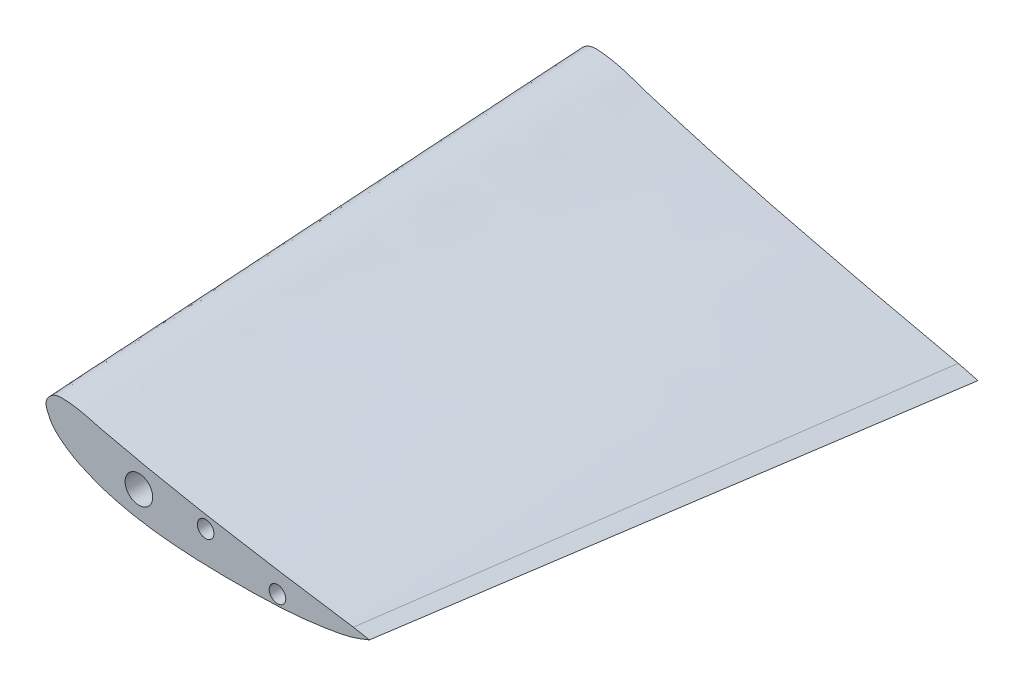
ISO-10303-21;
HEADER;
FILE_DESCRIPTION(('STEP AP214'),'2;1');
FILE_NAME('part.step','',(''),(''),'','','');
FILE_SCHEMA(('AUTOMOTIVE_DESIGN { 1 0 10303 214 1 1 1 1 }'));
ENDSEC;
DATA;
#1=APPLICATION_CONTEXT('core data for automotive mechanical design processes');
#2=APPLICATION_PROTOCOL_DEFINITION('international standard','automotive_design',2000,#1);
#3=PRODUCT_CONTEXT('',#1,'mechanical');
#4=PRODUCT('Part','Part','',(#3));
#5=PRODUCT_RELATED_PRODUCT_CATEGORY('part','',(#4));
#6=PRODUCT_DEFINITION_FORMATION('','',#4);
#7=PRODUCT_DEFINITION_CONTEXT('part definition',#1,'design');
#8=PRODUCT_DEFINITION('design','',#6,#7);
#9=PRODUCT_DEFINITION_SHAPE('','',#8);
#10=(LENGTH_UNIT() NAMED_UNIT(*) SI_UNIT(.MILLI.,.METRE.));
#11=(NAMED_UNIT(*) PLANE_ANGLE_UNIT() SI_UNIT($,.RADIAN.));
#12=(NAMED_UNIT(*) SI_UNIT($,.STERADIAN.) SOLID_ANGLE_UNIT());
#13=UNCERTAINTY_MEASURE_WITH_UNIT(LENGTH_MEASURE(1.E-05),#10,'distance_accuracy_value','');
#14=(GEOMETRIC_REPRESENTATION_CONTEXT(3) GLOBAL_UNCERTAINTY_ASSIGNED_CONTEXT((#13)) GLOBAL_UNIT_ASSIGNED_CONTEXT((#10,
#11,#12)) REPRESENTATION_CONTEXT('',''));
#15=CARTESIAN_POINT('',(0.,0.,0.));
#16=DIRECTION('',(0.,0.,1.));
#17=DIRECTION('',(1.,0.,0.));
#18=AXIS2_PLACEMENT_3D('',#15,#16,#17);
#19=CARTESIAN_POINT('',(-19.6811363137598,4.79492425979761,-100.));
#20=DIRECTION('',(0.,0.,1.));
#21=DIRECTION('',(1.,0.,0.));
#22=AXIS2_PLACEMENT_3D('',#19,#20,#21);
#23=PLANE('',#22);
#24=CARTESIAN_POINT('',(25.0709543311335,-3.88232454138966,-100.));
#25=DIRECTION('',(0.,0.,1.));
#26=DIRECTION('',(1.,0.,0.));
#27=AXIS2_PLACEMENT_3D('',#24,#25,#26);
#28=CIRCLE('',#27,1.5);
#29=CARTESIAN_POINT('',(26.5709543311335,-3.88232454138966,-100.));
#30=VERTEX_POINT('',#29);
#31=EDGE_CURVE('E86',#30,#30,#28,.T.);
#32=ORIENTED_EDGE('',*,*,#31,.T.);
#33=EDGE_LOOP('',(#32));
#34=FACE_BOUND('',#33,.T.);
#35=CARTESIAN_POINT('',(0.,0.,-100.));
#36=DIRECTION('',(0.,0.,1.));
#37=DIRECTION('',(1.,0.,0.));
#38=AXIS2_PLACEMENT_3D('',#35,#36,#37);
#39=CIRCLE('',#38,2.5);
#40=CARTESIAN_POINT('',(2.5,0.,-100.));
#41=VERTEX_POINT('',#40);
#42=EDGE_CURVE('E66',#41,#41,#39,.T.);
#43=ORIENTED_EDGE('',*,*,#42,.T.);
#44=EDGE_LOOP('',(#43));
#45=FACE_BOUND('',#44,.T.);
#46=CARTESIAN_POINT('',(48.2551757332759,-6.12373169062847,-100.));
#47=CARTESIAN_POINT('',(47.054535391202,-5.85246277333931,-100.));
#48=CARTESIAN_POINT('',(43.4526143649815,-5.03865602147288,-100.));
#49=CARTESIAN_POINT('',(37.4521284584218,-3.67078287712665,-100.));
#50=CARTESIAN_POINT('',(30.2393159603486,-2.0848495014263,-100.));
#51=CARTESIAN_POINT('',(23.0750893565596,-0.296270211024556,-100.));
#52=CARTESIAN_POINT('',(15.8843927973687,1.37993852480165,-100.));
#53=CARTESIAN_POINT('',(8.75580346600157,3.30185812214174,-100.));
#54=CARTESIAN_POINT('',(1.62312300397187,5.21389650059937,-100.));
#55=CARTESIAN_POINT('',(-4.26854985932617,6.99464303809463,-100.));
#56=CARTESIAN_POINT('',(-8.99230347266472,8.40124550387566,-100.));
#57=CARTESIAN_POINT('',(-11.8744834802206,9.50035957220869,-100.));
#58=CARTESIAN_POINT('',(-14.2839529373644,10.0663726357262,-100.));
#59=CARTESIAN_POINT('',(-16.1212661725206,10.3490202847083,-100.));
#60=CARTESIAN_POINT('',(-17.7947266612632,10.4763328510267,-100.));
#61=CARTESIAN_POINT('',(-19.4906059492009,9.82235552950465,-100.));
#62=CARTESIAN_POINT('',(-20.9447919807827,8.11478913625125,-100.));
#63=CARTESIAN_POINT('',(-20.2150047137434,6.03250555271122,-100.));
#64=CARTESIAN_POINT('',(-19.4602718509725,4.19440216003422,-100.));
#65=CARTESIAN_POINT('',(-18.1979949940236,2.65007560494015,-100.));
#66=CARTESIAN_POINT('',(-16.582152295265,1.25346484961709,-100.));
#67=CARTESIAN_POINT('',(-14.4984920142379,-0.370226607055651,-100.));
#68=CARTESIAN_POINT('',(-11.6642584136947,-1.86623233714782,-100.));
#69=CARTESIAN_POINT('',(-7.14608873902189,-3.98538532749056,-100.));
#70=CARTESIAN_POINT('',(-1.21045916642468,-5.79530860449215,-100.));
#71=CARTESIAN_POINT('',(6.04417290243166,-7.30748683583701,-100.));
#72=CARTESIAN_POINT('',(13.4266596421643,-8.24247032524399,-100.));
#73=CARTESIAN_POINT('',(20.8803633235686,-8.89671876227693,-100.));
#74=CARTESIAN_POINT('',(28.4085535518336,-9.32584807197122,-100.));
#75=CARTESIAN_POINT('',(36.0528911415558,-9.43269393728231,-100.));
#76=CARTESIAN_POINT('',(42.4989778165968,-8.98528636466733,-100.));
#77=CARTESIAN_POINT('',(47.832740527097,-8.34326163812348,-100.));
#78=CARTESIAN_POINT('',(50.4673414200419,-7.48747891974686,-100.));
#79=CARTESIAN_POINT('',(51.8293915668112,-7.04505176492108,-100.));
#80=B_SPLINE_CURVE_WITH_KNOTS('',3,(#46,#47,#48,#49,#50,#51,#52,#53,#54,#55,#56,#57,#58,#59,#60,
#61,#62,#63,#64,#65,#66,#67,#68,#69,#70,#71,#72,#73,#74,#75,#76,#77,#78,#79),.UNSPECIFIED.,.F.,
.F.,(4,1,1,1,1,1,1,1,1,1,1,1,1,1,1,1,1,1,1,1,1,1,1,1,1,1,1,1,1,1,1,4),(0.,0.024539223239315,
0.0736176697179449,0.122696116196575,0.171758102468826,0.220820088741077,0.269879113320182,
0.318936693489756,0.368025361597795,0.392583028094628,0.417173001250673,0.429440472758663,
0.441764658743505,0.454461371263475,0.461994015532278,0.477712656864197,0.492780517083889,
0.502278122505289,0.517831839222446,0.531656069899839,0.544957030128068,0.57036121074101,
0.595284183630096,0.644429948946362,0.693535769444944,0.742943262592495,0.792666042354747,
0.842690657547491,0.893260265870848,0.94491578158227,0.971522264346957,1.),.UNSPECIFIED.);
#81=CARTESIAN_POINT('',(48.2551757332759,-6.12373169062847,-100.));
#82=VERTEX_POINT('',#81);
#83=CARTESIAN_POINT('',(51.8293915668112,-7.04505176492108,-100.));
#84=VERTEX_POINT('',#83);
#85=EDGE_CURVE('E63',#82,#84,#80,.T.);
#86=ORIENTED_EDGE('',*,*,#85,.F.);
#87=DIRECTION('',(-0.968346652590715,0.249609215407518,0.));
#88=VECTOR('',#87,1.);
#89=CARTESIAN_POINT('',(48.2551757332759,-6.12373169062847,-100.));
#90=LINE('',#89,#88);
#91=EDGE_CURVE('E37',#84,#82,#90,.T.);
#92=ORIENTED_EDGE('',*,*,#91,.F.);
#93=EDGE_LOOP('',(#86,#92));
#94=FACE_BOUND('',#93,.T.);
#95=ADVANCED_FACE('F34',(#34,#45,#94),#23,.F.);
#96=CARTESIAN_POINT('',(-15.9573386578838,2.72947172335381,0.));
#97=DIRECTION('',(0.,0.,1.));
#98=DIRECTION('',(1.,0.,0.));
#99=AXIS2_PLACEMENT_3D('',#96,#97,#98);
#100=PLANE('',#99);
#101=CARTESIAN_POINT('',(12.063322186895,-0.172116284613179,0.));
#102=DIRECTION('',(0.,0.,1.));
#103=DIRECTION('',(1.,0.,0.));
#104=AXIS2_PLACEMENT_3D('',#101,#102,#103);
#105=CIRCLE('',#104,1.5);
#106=CARTESIAN_POINT('',(13.563322186895,-0.172116284613179,0.));
#107=VERTEX_POINT('',#106);
#108=EDGE_CURVE('E95',#107,#107,#105,.T.);
#109=ORIENTED_EDGE('',*,*,#108,.F.);
#110=EDGE_LOOP('',(#109));
#111=FACE_BOUND('',#110,.T.);
#112=CARTESIAN_POINT('',(25.0709543311335,-3.88232454138966,0.));
#113=DIRECTION('',(0.,0.,1.));
#114=DIRECTION('',(1.,0.,0.));
#115=AXIS2_PLACEMENT_3D('',#112,#113,#114);
#116=CIRCLE('',#115,1.5);
#117=CARTESIAN_POINT('',(26.5709543311335,-3.88232454138966,0.));
#118=VERTEX_POINT('',#117);
#119=EDGE_CURVE('E89',#118,#118,#116,.T.);
#120=ORIENTED_EDGE('',*,*,#119,.F.);
#121=EDGE_LOOP('',(#120));
#122=FACE_BOUND('',#121,.T.);
#123=CARTESIAN_POINT('',(0.,0.,0.));
#124=DIRECTION('',(0.,0.,1.));
#125=DIRECTION('',(1.,0.,0.));
#126=AXIS2_PLACEMENT_3D('',#123,#124,#125);
#127=CIRCLE('',#126,2.5);
#128=CARTESIAN_POINT('',(2.5,0.,0.));
#129=VERTEX_POINT('',#128);
#130=EDGE_CURVE('E80',#129,#129,#127,.T.);
#131=ORIENTED_EDGE('',*,*,#130,.F.);
#132=EDGE_LOOP('',(#131));
#133=FACE_BOUND('',#132,.T.);
#134=CARTESIAN_POINT('',(38.8120781774416,-2.20153056453192,0.));
#135=CARTESIAN_POINT('',(37.8397868419316,-2.05195685649604,0.));
#136=CARTESIAN_POINT('',(34.9229128354023,-1.60323573238921,0.));
#137=CARTESIAN_POINT('',(30.062980923386,-0.846025072664264,0.));
#138=CARTESIAN_POINT('',(24.2243965531818,0.0176889752878256,0.));
#139=CARTESIAN_POINT('',(18.4132903557065,1.04566342823261,0.));
#140=CARTESIAN_POINT('',(12.5873231478176,1.98257894073304,0.));
#141=CARTESIAN_POINT('',(6.79722177850616,3.11883992926039,0.));
#142=CARTESIAN_POINT('',(1.00440763839932,4.24699575258884,0.));
#143=CARTESIAN_POINT('',(-3.79170799952262,5.33941839040036,0.));
#144=CARTESIAN_POINT('',(-7.63590457845037,6.19843141355677,0.));
#145=CARTESIAN_POINT('',(-9.99480768621524,6.91459953998816,0.));
#146=CARTESIAN_POINT('',(-11.9472230297003,7.23200790023331,0.));
#147=CARTESIAN_POINT('',(-13.4277399267656,7.35528494884751,0.));
#148=CARTESIAN_POINT('',(-14.768994504793,7.36382199207013,0.));
#149=CARTESIAN_POINT('',(-16.0847204559753,6.74822291699015,0.));
#150=CARTESIAN_POINT('',(-17.1492251932457,5.30606659514906,0.));
#151=CARTESIAN_POINT('',(-16.4517203902266,3.68648758126931,0.));
#152=CARTESIAN_POINT('',(-15.7478921773808,2.26296929841352,0.));
#153=CARTESIAN_POINT('',(-14.6557396375938,1.10186245155615,0.));
#154=CARTESIAN_POINT('',(-13.2899093160326,0.0781647088307033,0.));
#155=CARTESIAN_POINT('',(-11.5384922386438,-1.10058705011428,0.));
#156=CARTESIAN_POINT('',(-9.19576672428071,-2.13584430490646,0.));
#157=CARTESIAN_POINT('',(-5.47589025803957,-3.5743655347333,0.));
#158=CARTESIAN_POINT('',(-0.643108893754979,-4.68760771879476,0.));
#159=CARTESIAN_POINT('',(5.22471927578042,-5.49019662314985,0.));
#160=CARTESIAN_POINT('',(11.1624164545053,-5.82550900839239,0.));
#161=CARTESIAN_POINT('',(17.1412966125503,-5.93304648920771,0.));
#162=CARTESIAN_POINT('',(23.1670560499333,-5.85696775159353,0.));
#163=CARTESIAN_POINT('',(29.2675115694788,-5.51749328815515,0.));
#164=CARTESIAN_POINT('',(34.3818603874594,-4.80270030943601,0.));
#165=CARTESIAN_POINT('',(38.5985870919679,-3.99453880924095,0.));
#166=CARTESIAN_POINT('',(40.6515069729154,-3.16590061016798,0.));
#167=CARTESIAN_POINT('',(41.71283654,-2.73750677500001,0.));
#168=B_SPLINE_CURVE_WITH_KNOTS('',3,(#134,#135,#136,#137,#138,#139,#140,#141,#142,#143,#144,
#145,#146,#147,#148,#149,#150,#151,#152,#153,#154,#155,#156,#157,#158,#159,#160,#161,#162,#163,
#164,#165,#166,#167),.UNSPECIFIED.,.F.,.F.,(4,1,1,1,1,1,1,1,1,1,1,1,1,1,1,1,1,1,1,1,1,1,1,1,1,1,
1,1,1,1,1,4),(0.,0.024539223239315,0.0736176697179449,0.122696116196575,0.171758102468826,
0.220820088741077,0.269879113320182,0.318936693489756,0.368025361597795,0.392583028094628,
0.417173001250673,0.429440472758663,0.441764658743505,0.454461371263475,0.461994015532278,
0.477712656864197,0.492780517083889,0.502278122505289,0.517831839222446,0.531656069899839,
0.544957030128068,0.57036121074101,0.595284183630096,0.644429948946362,0.693535769444944,
0.742943262592495,0.792666042354747,0.842690657547491,0.893260265870848,0.94491578158227,
0.971522264346957,1.),.UNSPECIFIED.);
#169=CARTESIAN_POINT('',(38.8120781774416,-2.20153056453192,0.));
#170=VERTEX_POINT('',#169);
#171=CARTESIAN_POINT('',(41.71283654,-2.73750677500001,0.));
#172=VERTEX_POINT('',#171);
#173=EDGE_CURVE('E43',#170,#172,#168,.T.);
#174=ORIENTED_EDGE('',*,*,#173,.T.);
#175=DIRECTION('',(-0.983354838258924,0.18169552023307,0.));
#176=VECTOR('',#175,1.);
#177=CARTESIAN_POINT('',(38.8120781774416,-2.20153056453192,0.));
#178=LINE('',#177,#176);
#179=EDGE_CURVE('E11',#172,#170,#178,.T.);
#180=ORIENTED_EDGE('',*,*,#179,.T.);
#181=EDGE_LOOP('',(#174,#180));
#182=FACE_BOUND('',#181,.T.);
#183=ADVANCED_FACE('F110',(#111,#122,#133,#182),#100,.T.);
#184=CARTESIAN_POINT('',(41.71283654,-2.73750677500001,0.));
#185=CARTESIAN_POINT('',(51.8293915668112,-7.04505176492108,-100.));
#186=CARTESIAN_POINT('',(40.6515069729154,-3.16590061016798,0.));
#187=CARTESIAN_POINT('',(50.4673414200419,-7.48747891974686,-100.));
#188=CARTESIAN_POINT('',(38.5985870919679,-3.99453880924095,0.));
#189=CARTESIAN_POINT('',(47.832740527097,-8.34326163812348,-100.));
#190=CARTESIAN_POINT('',(34.3818603874594,-4.80270030943601,0.));
#191=CARTESIAN_POINT('',(42.4989778165968,-8.98528636466733,-100.));
#192=CARTESIAN_POINT('',(29.2675115694788,-5.51749328815515,0.));
#193=CARTESIAN_POINT('',(36.0528911415558,-9.43269393728231,-100.));
#194=CARTESIAN_POINT('',(23.1670560499333,-5.85696775159353,0.));
#195=CARTESIAN_POINT('',(28.4085535518336,-9.32584807197122,-100.));
#196=CARTESIAN_POINT('',(17.1412966125503,-5.93304648920771,0.));
#197=CARTESIAN_POINT('',(20.8803633235686,-8.89671876227693,-100.));
#198=CARTESIAN_POINT('',(11.1624164545053,-5.82550900839239,0.));
#199=CARTESIAN_POINT('',(13.4266596421643,-8.24247032524399,-100.));
#200=CARTESIAN_POINT('',(5.22471927578042,-5.49019662314985,0.));
#201=CARTESIAN_POINT('',(6.04417290243166,-7.30748683583701,-100.));
#202=CARTESIAN_POINT('',(-0.643108893754979,-4.68760771879476,0.));
#203=CARTESIAN_POINT('',(-1.21045916642468,-5.79530860449215,-100.));
#204=CARTESIAN_POINT('',(-5.47589025803957,-3.5743655347333,0.));
#205=CARTESIAN_POINT('',(-7.14608873902189,-3.98538532749056,-100.));
#206=CARTESIAN_POINT('',(-9.19576672428071,-2.13584430490646,0.));
#207=CARTESIAN_POINT('',(-11.6642584136947,-1.86623233714782,-100.));
#208=CARTESIAN_POINT('',(-11.5384922386438,-1.10058705011428,0.));
#209=CARTESIAN_POINT('',(-14.4984920142379,-0.370226607055651,-100.));
#210=CARTESIAN_POINT('',(-13.2899093160326,0.0781647088307033,0.));
#211=CARTESIAN_POINT('',(-16.582152295265,1.25346484961709,-100.));
#212=CARTESIAN_POINT('',(-14.6557396375938,1.10186245155615,0.));
#213=CARTESIAN_POINT('',(-18.1979949940236,2.65007560494015,-100.));
#214=CARTESIAN_POINT('',(-15.7478921773808,2.26296929841352,0.));
#215=CARTESIAN_POINT('',(-19.4602718509725,4.19440216003422,-100.));
#216=CARTESIAN_POINT('',(-16.4517203902266,3.68648758126931,0.));
#217=CARTESIAN_POINT('',(-20.2150047137434,6.03250555271122,-100.));
#218=CARTESIAN_POINT('',(-17.1492251932457,5.30606659514906,0.));
#219=CARTESIAN_POINT('',(-20.9447919807827,8.11478913625125,-100.));
#220=CARTESIAN_POINT('',(-16.0847204559753,6.74822291699015,0.));
#221=CARTESIAN_POINT('',(-19.4906059492009,9.82235552950465,-100.));
#222=CARTESIAN_POINT('',(-14.768994504793,7.36382199207013,0.));
#223=CARTESIAN_POINT('',(-17.7947266612632,10.4763328510267,-100.));
#224=CARTESIAN_POINT('',(-13.4277399267656,7.35528494884751,0.));
#225=CARTESIAN_POINT('',(-16.1212661725206,10.3490202847083,-100.));
#226=CARTESIAN_POINT('',(-11.9472230297003,7.23200790023331,0.));
#227=CARTESIAN_POINT('',(-14.2839529373644,10.0663726357262,-100.));
#228=CARTESIAN_POINT('',(-9.99480768621524,6.91459953998816,0.));
#229=CARTESIAN_POINT('',(-11.8744834802206,9.50035957220869,-100.));
#230=CARTESIAN_POINT('',(-7.63590457845037,6.19843141355677,0.));
#231=CARTESIAN_POINT('',(-8.99230347266472,8.40124550387566,-100.));
#232=CARTESIAN_POINT('',(-3.79170799952262,5.33941839040036,0.));
#233=CARTESIAN_POINT('',(-4.26854985932617,6.99464303809463,-100.));
#234=CARTESIAN_POINT('',(1.00440763839932,4.24699575258884,0.));
#235=CARTESIAN_POINT('',(1.62312300397187,5.21389650059937,-100.));
#236=CARTESIAN_POINT('',(6.79722177850616,3.11883992926039,0.));
#237=CARTESIAN_POINT('',(8.75580346600157,3.30185812214174,-100.));
#238=CARTESIAN_POINT('',(12.5873231478176,1.98257894073304,0.));
#239=CARTESIAN_POINT('',(15.8843927973687,1.37993852480165,-100.));
#240=CARTESIAN_POINT('',(18.4132903557065,1.04566342823261,0.));
#241=CARTESIAN_POINT('',(23.0750893565596,-0.296270211024556,-100.));
#242=CARTESIAN_POINT('',(24.2243965531818,0.0176889752878256,0.));
#243=CARTESIAN_POINT('',(30.2393159603486,-2.0848495014263,-100.));
#244=CARTESIAN_POINT('',(30.062980923386,-0.846025072664264,0.));
#245=CARTESIAN_POINT('',(37.4521284584218,-3.67078287712665,-100.));
#246=CARTESIAN_POINT('',(34.9229128354023,-1.60323573238921,0.));
#247=CARTESIAN_POINT('',(43.4526143649815,-5.03865602147288,-100.));
#248=CARTESIAN_POINT('',(37.8397868419316,-2.05195685649604,0.));
#249=CARTESIAN_POINT('',(47.054535391202,-5.85246277333931,-100.));
#250=CARTESIAN_POINT('',(38.8120781774416,-2.20153056453192,0.));
#251=CARTESIAN_POINT('',(48.2551757332759,-6.12373169062847,-100.));
#252=B_SPLINE_SURFACE_WITH_KNOTS('',3,1,((#184,#185),(#186,#187),(#188,#189),(#190,#191),(#192,
#193),(#194,#195),(#196,#197),(#198,#199),(#200,#201),(#202,#203),(#204,#205),(#206,#207),(#208,
#209),(#210,#211),(#212,#213),(#214,#215),(#216,#217),(#218,#219),(#220,#221),(#222,#223),(#224,
#225),(#226,#227),(#228,#229),(#230,#231),(#232,#233),(#234,#235),(#236,#237),(#238,#239),(#240,
#241),(#242,#243),(#244,#245),(#246,#247),(#248,#249),(#250,#251)),.UNSPECIFIED.,.F.,.F.,.F.,(4,
1,1,1,1,1,1,1,1,1,1,1,1,1,1,1,1,1,1,1,1,1,1,1,1,1,1,1,1,1,1,4),(2,2),(0.,0.0284777356530428,
0.05508421841773,0.106739734129152,0.157309342452509,0.207333957645253,0.257056737407505,
0.306464230555056,0.355570051053638,0.404715816369904,0.42963878925899,0.455042969871932,
0.468343930100161,0.482168160777554,0.497721877494711,0.507219482916111,0.522287343135803,
0.538005984467722,0.545538628736525,0.558235341256495,0.570559527241337,0.582826998749327,
0.607416971905372,0.631974638402205,0.681063306510244,0.730120886679818,0.779179911258923,
0.828241897531174,0.877303883803425,0.926382330282055,0.975460776760685,1.),(0.,1.),.UNSPECIFIED.);
#253=DIRECTION('',(0.0939411482106713,-0.0390185609245405,-0.994812853041334));
#254=VECTOR('',#253,1.);
#255=CARTESIAN_POINT('',(43.5336269553587,-4.1626311275802,-50.));
#256=LINE('',#255,#254);
#257=EDGE_CURVE('E58',#170,#82,#256,.T.);
#258=DIRECTION('',(-0.100559496265549,0.042817397145537,0.994009284771777));
#259=VECTOR('',#258,1.);
#260=CARTESIAN_POINT('',(46.7711140534056,-4.89127926996054,-50.));
#261=LINE('',#260,#259);
#262=EDGE_CURVE('E52',#84,#172,#261,.T.);
#263=ORIENTED_EDGE('',*,*,#173,.F.);
#264=ORIENTED_EDGE('',*,*,#257,.T.);
#265=ORIENTED_EDGE('',*,*,#85,.T.);
#266=ORIENTED_EDGE('',*,*,#262,.T.);
#267=EDGE_LOOP('',(#263,#264,#265,#266));
#268=FACE_BOUND('',#267,.T.);
#269=ADVANCED_FACE('F65',(#268),#252,.T.);
#270=CARTESIAN_POINT('',(38.8120781774416,-2.20153056453192,0.));
#271=CARTESIAN_POINT('',(48.2551757332759,-6.12373169062847,-100.));
#272=CARTESIAN_POINT('',(39.2955379045347,-2.29085993294327,0.));
#273=CARTESIAN_POINT('',(48.8508783721984,-6.27728503634391,-100.));
#274=CARTESIAN_POINT('',(39.7789976316277,-2.38018930135461,0.));
#275=CARTESIAN_POINT('',(49.446581011121,-6.43083838205934,-100.));
#276=CARTESIAN_POINT('',(40.7459170858139,-2.55884803817731,0.));
#277=CARTESIAN_POINT('',(50.6379862889661,-6.73794507349021,-100.));
#278=CARTESIAN_POINT('',(41.2293768129069,-2.64817740658866,0.));
#279=CARTESIAN_POINT('',(51.2336889278886,-6.89149841920564,-100.));
#280=CARTESIAN_POINT('',(41.71283654,-2.73750677500001,0.));
#281=CARTESIAN_POINT('',(51.8293915668112,-7.04505176492108,-100.));
#282=B_SPLINE_SURFACE_WITH_KNOTS('',3,1,((#270,#271),(#272,#273),(#274,#275),(#276,#277),(#278,
#279),(#280,#281)),.UNSPECIFIED.,.F.,.F.,.F.,(4,2,4),(2,2),(0.,0.5,1.),(0.,1.),.UNSPECIFIED.);
#283=ORIENTED_EDGE('',*,*,#179,.F.);
#284=ORIENTED_EDGE('',*,*,#262,.F.);
#285=ORIENTED_EDGE('',*,*,#91,.T.);
#286=ORIENTED_EDGE('',*,*,#257,.F.);
#287=EDGE_LOOP('',(#283,#284,#285,#286));
#288=FACE_BOUND('',#287,.T.);
#289=ADVANCED_FACE('F67',(#288),#282,.T.);
#290=CARTESIAN_POINT('',(0.,0.,-100.));
#291=DIRECTION('',(0.,0.,1.));
#292=DIRECTION('',(1.,0.,0.));
#293=AXIS2_PLACEMENT_3D('',#290,#291,#292);
#294=CYLINDRICAL_SURFACE('',#293,2.5);
#295=ORIENTED_EDGE('',*,*,#42,.F.);
#296=EDGE_LOOP('',(#295));
#297=FACE_BOUND('',#296,.T.);
#298=ORIENTED_EDGE('',*,*,#130,.T.);
#299=EDGE_LOOP('',(#298));
#300=FACE_BOUND('',#299,.T.);
#301=ADVANCED_FACE('F119',(#297,#300),#294,.F.);
#302=CARTESIAN_POINT('',(25.0709543311335,-3.88232454138966,-100.));
#303=DIRECTION('',(0.,0.,1.));
#304=DIRECTION('',(1.,0.,0.));
#305=AXIS2_PLACEMENT_3D('',#302,#303,#304);
#306=CYLINDRICAL_SURFACE('',#305,1.5);
#307=ORIENTED_EDGE('',*,*,#31,.F.);
#308=EDGE_LOOP('',(#307));
#309=FACE_BOUND('',#308,.T.);
#310=ORIENTED_EDGE('',*,*,#119,.T.);
#311=EDGE_LOOP('',(#310));
#312=FACE_BOUND('',#311,.T.);
#313=ADVANCED_FACE('F106',(#309,#312),#306,.F.);
#314=CARTESIAN_POINT('',(12.063322186895,-0.172116284613179,-10.));
#315=DIRECTION('',(0.,0.,1.));
#316=DIRECTION('',(1.,0.,0.));
#317=AXIS2_PLACEMENT_3D('',#314,#315,#316);
#318=CYLINDRICAL_SURFACE('',#317,1.5);
#319=CARTESIAN_POINT('',(12.063322186895,-0.172116284613179,-10.));
#320=DIRECTION('',(0.,0.,1.));
#321=DIRECTION('',(1.,0.,0.));
#322=AXIS2_PLACEMENT_3D('',#319,#320,#321);
#323=CIRCLE('',#322,1.5);
#324=CARTESIAN_POINT('',(13.563322186895,-0.172116284613179,-10.));
#325=VERTEX_POINT('',#324);
#326=EDGE_CURVE('E92',#325,#325,#323,.T.);
#327=ORIENTED_EDGE('',*,*,#326,.F.);
#328=EDGE_LOOP('',(#327));
#329=FACE_BOUND('',#328,.T.);
#330=ORIENTED_EDGE('',*,*,#108,.T.);
#331=EDGE_LOOP('',(#330));
#332=FACE_BOUND('',#331,.T.);
#333=ADVANCED_FACE('F103',(#329,#332),#318,.F.);
#334=CARTESIAN_POINT('',(12.063322186895,-0.172116284613179,-10.));
#335=DIRECTION('',(0.,0.,1.));
#336=DIRECTION('',(1.,0.,0.));
#337=AXIS2_PLACEMENT_3D('',#334,#335,#336);
#338=PLANE('',#337);
#339=ORIENTED_EDGE('',*,*,#326,.T.);
#340=EDGE_LOOP('',(#339));
#341=FACE_BOUND('',#340,.T.);
#342=ADVANCED_FACE('F101',(#341),#338,.T.);
#343=CLOSED_SHELL('',(#95,#183,#269,#289,#301,#313,#333,#342));
#344=MANIFOLD_SOLID_BREP('B2',#343);
#345=ADVANCED_BREP_SHAPE_REPRESENTATION('',(#18,#344),#14);
#346=SHAPE_DEFINITION_REPRESENTATION(#9,#345);
ENDSEC;
END-ISO-10303-21;
